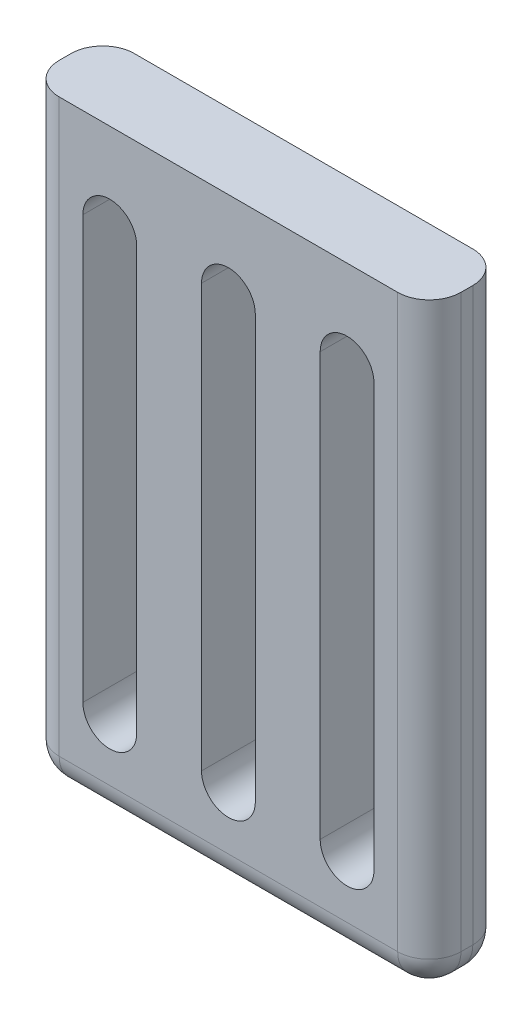
ISO-10303-21;
HEADER;
FILE_DESCRIPTION(('STEP AP214'),'2;1');
FILE_NAME('part.step','',(''),(''),'','','');
FILE_SCHEMA(('AUTOMOTIVE_DESIGN { 1 0 10303 214 1 1 1 1 }'));
ENDSEC;
DATA;
#1=APPLICATION_CONTEXT('core data for automotive mechanical design processes');
#2=APPLICATION_PROTOCOL_DEFINITION('international standard','automotive_design',2000,#1);
#3=PRODUCT_CONTEXT('',#1,'mechanical');
#4=PRODUCT('Part','Part','',(#3));
#5=PRODUCT_RELATED_PRODUCT_CATEGORY('part','',(#4));
#6=PRODUCT_DEFINITION_FORMATION('','',#4);
#7=PRODUCT_DEFINITION_CONTEXT('part definition',#1,'design');
#8=PRODUCT_DEFINITION('design','',#6,#7);
#9=PRODUCT_DEFINITION_SHAPE('','',#8);
#10=(LENGTH_UNIT() NAMED_UNIT(*) SI_UNIT(.MILLI.,.METRE.));
#11=(NAMED_UNIT(*) PLANE_ANGLE_UNIT() SI_UNIT($,.RADIAN.));
#12=(NAMED_UNIT(*) SI_UNIT($,.STERADIAN.) SOLID_ANGLE_UNIT());
#13=UNCERTAINTY_MEASURE_WITH_UNIT(LENGTH_MEASURE(1.E-05),#10,'distance_accuracy_value','');
#14=(GEOMETRIC_REPRESENTATION_CONTEXT(3) GLOBAL_UNCERTAINTY_ASSIGNED_CONTEXT((#13)) GLOBAL_UNIT_ASSIGNED_CONTEXT((#10,
#11,#12)) REPRESENTATION_CONTEXT('',''));
#15=CARTESIAN_POINT('',(0.,0.,0.));
#16=DIRECTION('',(0.,0.,1.));
#17=DIRECTION('',(1.,0.,0.));
#18=AXIS2_PLACEMENT_3D('',#15,#16,#17);
#19=CARTESIAN_POINT('',(0.,-13.35,0.));
#20=DIRECTION('',(0.,0.,1.));
#21=DIRECTION('',(1.,0.,0.));
#22=AXIS2_PLACEMENT_3D('',#19,#20,#21);
#23=CYLINDRICAL_SURFACE('',#22,1.7);
#24=DIRECTION('',(0.,0.,-1.));
#25=VECTOR('',#24,1.);
#26=CARTESIAN_POINT('',(1.7,-13.35,0.));
#27=LINE('',#26,#25);
#28=CARTESIAN_POINT('',(1.7,-13.35,0.));
#29=VERTEX_POINT('',#28);
#30=CARTESIAN_POINT('',(1.7,-13.35,4.75));
#31=VERTEX_POINT('',#30);
#32=EDGE_CURVE('E446',#29,#31,#27,.F.);
#33=ORIENTED_EDGE('',*,*,#32,.F.);
#34=CARTESIAN_POINT('',(0.,-13.35,0.));
#35=DIRECTION('',(0.,0.,1.));
#36=DIRECTION('',(1.,0.,0.));
#37=AXIS2_PLACEMENT_3D('',#34,#35,#36);
#38=CIRCLE('',#37,1.7);
#39=CARTESIAN_POINT('',(-1.7,-13.35,0.));
#40=VERTEX_POINT('',#39);
#41=EDGE_CURVE('E56',#29,#40,#38,.F.);
#42=ORIENTED_EDGE('',*,*,#41,.T.);
#43=DIRECTION('',(0.,0.,-1.));
#44=VECTOR('',#43,1.);
#45=CARTESIAN_POINT('',(-1.7,-13.35,0.));
#46=LINE('',#45,#44);
#47=CARTESIAN_POINT('',(-1.7,-13.35,4.75));
#48=VERTEX_POINT('',#47);
#49=EDGE_CURVE('E450',#48,#40,#46,.T.);
#50=ORIENTED_EDGE('',*,*,#49,.F.);
#51=CARTESIAN_POINT('',(0.,-13.35,4.75));
#52=DIRECTION('',(0.,0.,1.));
#53=DIRECTION('',(1.,0.,0.));
#54=AXIS2_PLACEMENT_3D('',#51,#52,#53);
#55=CIRCLE('',#54,1.7);
#56=EDGE_CURVE('E11',#48,#31,#55,.T.);
#57=ORIENTED_EDGE('',*,*,#56,.T.);
#58=EDGE_LOOP('',(#33,#42,#50,#57));
#59=FACE_BOUND('',#58,.T.);
#60=ADVANCED_FACE('F47',(#59),#23,.F.);
#61=CARTESIAN_POINT('',(0.,13.35,0.));
#62=DIRECTION('',(0.,0.,1.));
#63=DIRECTION('',(1.,0.,0.));
#64=AXIS2_PLACEMENT_3D('',#61,#62,#63);
#65=CYLINDRICAL_SURFACE('',#64,1.7);
#66=DIRECTION('',(0.,0.,-1.));
#67=VECTOR('',#66,1.);
#68=CARTESIAN_POINT('',(-1.7,13.35,0.));
#69=LINE('',#68,#67);
#70=CARTESIAN_POINT('',(-1.7,13.35,0.));
#71=VERTEX_POINT('',#70);
#72=CARTESIAN_POINT('',(-1.7,13.35,4.75));
#73=VERTEX_POINT('',#72);
#74=EDGE_CURVE('E385',#71,#73,#69,.F.);
#75=ORIENTED_EDGE('',*,*,#74,.F.);
#76=CARTESIAN_POINT('',(0.,13.35,0.));
#77=DIRECTION('',(0.,0.,1.));
#78=DIRECTION('',(1.,0.,0.));
#79=AXIS2_PLACEMENT_3D('',#76,#77,#78);
#80=CIRCLE('',#79,1.7);
#81=CARTESIAN_POINT('',(1.7,13.35,0.));
#82=VERTEX_POINT('',#81);
#83=EDGE_CURVE('E439',#71,#82,#80,.F.);
#84=ORIENTED_EDGE('',*,*,#83,.T.);
#85=DIRECTION('',(0.,0.,-1.));
#86=VECTOR('',#85,1.);
#87=CARTESIAN_POINT('',(1.7,13.35,0.));
#88=LINE('',#87,#86);
#89=CARTESIAN_POINT('',(1.7,13.35,4.75));
#90=VERTEX_POINT('',#89);
#91=EDGE_CURVE('E435',#90,#82,#88,.T.);
#92=ORIENTED_EDGE('',*,*,#91,.F.);
#93=CARTESIAN_POINT('',(0.,13.35,4.75));
#94=DIRECTION('',(0.,0.,1.));
#95=DIRECTION('',(1.,0.,0.));
#96=AXIS2_PLACEMENT_3D('',#93,#94,#95);
#97=CIRCLE('',#96,1.7);
#98=EDGE_CURVE('E443',#90,#73,#97,.T.);
#99=ORIENTED_EDGE('',*,*,#98,.T.);
#100=EDGE_LOOP('',(#75,#84,#92,#99));
#101=FACE_BOUND('',#100,.T.);
#102=ADVANCED_FACE('F477',(#101),#65,.F.);
#103=CARTESIAN_POINT('',(7.5,-13.35,4.75));
#104=DIRECTION('',(0.,0.,1.));
#105=DIRECTION('',(1.,0.,0.));
#106=AXIS2_PLACEMENT_3D('',#103,#104,#105);
#107=CYLINDRICAL_SURFACE('',#106,1.7);
#108=DIRECTION('',(0.,0.,-1.));
#109=VECTOR('',#108,1.);
#110=CARTESIAN_POINT('',(5.8,-13.35,4.75));
#111=LINE('',#110,#109);
#112=CARTESIAN_POINT('',(5.8,-13.35,4.75));
#113=VERTEX_POINT('',#112);
#114=CARTESIAN_POINT('',(5.8,-13.35,0.));
#115=VERTEX_POINT('',#114);
#116=EDGE_CURVE('E309',#113,#115,#111,.T.);
#117=ORIENTED_EDGE('',*,*,#116,.F.);
#118=CARTESIAN_POINT('',(7.5,-13.35,4.75));
#119=DIRECTION('',(0.,0.,1.));
#120=DIRECTION('',(1.,0.,0.));
#121=AXIS2_PLACEMENT_3D('',#118,#119,#120);
#122=CIRCLE('',#121,1.7);
#123=CARTESIAN_POINT('',(9.2,-13.35,4.75));
#124=VERTEX_POINT('',#123);
#125=EDGE_CURVE('E317',#113,#124,#122,.T.);
#126=ORIENTED_EDGE('',*,*,#125,.T.);
#127=DIRECTION('',(0.,0.,-1.));
#128=VECTOR('',#127,1.);
#129=CARTESIAN_POINT('',(9.2,-13.35,4.75));
#130=LINE('',#129,#128);
#131=CARTESIAN_POINT('',(9.2,-13.35,0.));
#132=VERTEX_POINT('',#131);
#133=EDGE_CURVE('E313',#132,#124,#130,.F.);
#134=ORIENTED_EDGE('',*,*,#133,.F.);
#135=CARTESIAN_POINT('',(7.5,-13.35,0.));
#136=DIRECTION('',(0.,0.,1.));
#137=DIRECTION('',(1.,0.,0.));
#138=AXIS2_PLACEMENT_3D('',#135,#136,#137);
#139=CIRCLE('',#138,1.7);
#140=EDGE_CURVE('E320',#132,#115,#139,.F.);
#141=ORIENTED_EDGE('',*,*,#140,.T.);
#142=EDGE_LOOP('',(#117,#126,#134,#141));
#143=FACE_BOUND('',#142,.T.);
#144=ADVANCED_FACE('F472',(#143),#107,.F.);
#145=CARTESIAN_POINT('',(7.5,13.35,0.));
#146=DIRECTION('',(0.,0.,1.));
#147=DIRECTION('',(1.,0.,0.));
#148=AXIS2_PLACEMENT_3D('',#145,#146,#147);
#149=CYLINDRICAL_SURFACE('',#148,1.7);
#150=DIRECTION('',(0.,0.,-1.));
#151=VECTOR('',#150,1.);
#152=CARTESIAN_POINT('',(5.8,13.35,0.));
#153=LINE('',#152,#151);
#154=CARTESIAN_POINT('',(5.8,13.35,0.));
#155=VERTEX_POINT('',#154);
#156=CARTESIAN_POINT('',(5.8,13.35,4.75));
#157=VERTEX_POINT('',#156);
#158=EDGE_CURVE('E294',#155,#157,#153,.F.);
#159=ORIENTED_EDGE('',*,*,#158,.F.);
#160=CARTESIAN_POINT('',(7.5,13.35,0.));
#161=DIRECTION('',(0.,0.,1.));
#162=DIRECTION('',(1.,0.,0.));
#163=AXIS2_PLACEMENT_3D('',#160,#161,#162);
#164=CIRCLE('',#163,1.7);
#165=CARTESIAN_POINT('',(9.2,13.35,0.));
#166=VERTEX_POINT('',#165);
#167=EDGE_CURVE('E302',#155,#166,#164,.F.);
#168=ORIENTED_EDGE('',*,*,#167,.T.);
#169=DIRECTION('',(0.,0.,-1.));
#170=VECTOR('',#169,1.);
#171=CARTESIAN_POINT('',(9.2,13.35,0.));
#172=LINE('',#171,#170);
#173=CARTESIAN_POINT('',(9.2,13.35,4.75));
#174=VERTEX_POINT('',#173);
#175=EDGE_CURVE('E298',#174,#166,#172,.T.);
#176=ORIENTED_EDGE('',*,*,#175,.F.);
#177=CARTESIAN_POINT('',(7.5,13.35,4.75));
#178=DIRECTION('',(0.,0.,1.));
#179=DIRECTION('',(1.,0.,0.));
#180=AXIS2_PLACEMENT_3D('',#177,#178,#179);
#181=CIRCLE('',#180,1.7);
#182=EDGE_CURVE('E306',#174,#157,#181,.T.);
#183=ORIENTED_EDGE('',*,*,#182,.T.);
#184=EDGE_LOOP('',(#159,#168,#176,#183));
#185=FACE_BOUND('',#184,.T.);
#186=ADVANCED_FACE('F463',(#185),#149,.F.);
#187=CARTESIAN_POINT('',(-7.5,-13.35,4.75));
#188=DIRECTION('',(0.,0.,1.));
#189=DIRECTION('',(1.,0.,0.));
#190=AXIS2_PLACEMENT_3D('',#187,#188,#189);
#191=CYLINDRICAL_SURFACE('',#190,1.7);
#192=DIRECTION('',(0.,0.,-1.));
#193=VECTOR('',#192,1.);
#194=CARTESIAN_POINT('',(-9.2,-13.35,4.75));
#195=LINE('',#194,#193);
#196=CARTESIAN_POINT('',(-9.2,-13.35,4.75));
#197=VERTEX_POINT('',#196);
#198=CARTESIAN_POINT('',(-9.2,-13.35,0.));
#199=VERTEX_POINT('',#198);
#200=EDGE_CURVE('E208',#197,#199,#195,.T.);
#201=ORIENTED_EDGE('',*,*,#200,.F.);
#202=CARTESIAN_POINT('',(-7.5,-13.35,4.75));
#203=DIRECTION('',(0.,0.,1.));
#204=DIRECTION('',(1.,0.,0.));
#205=AXIS2_PLACEMENT_3D('',#202,#203,#204);
#206=CIRCLE('',#205,1.7);
#207=CARTESIAN_POINT('',(-5.8,-13.35,4.75));
#208=VERTEX_POINT('',#207);
#209=EDGE_CURVE('E223',#197,#208,#206,.T.);
#210=ORIENTED_EDGE('',*,*,#209,.T.);
#211=DIRECTION('',(0.,0.,-1.));
#212=VECTOR('',#211,1.);
#213=CARTESIAN_POINT('',(-5.8,-13.35,4.75));
#214=LINE('',#213,#212);
#215=CARTESIAN_POINT('',(-5.8,-13.35,0.));
#216=VERTEX_POINT('',#215);
#217=EDGE_CURVE('E285',#216,#208,#214,.F.);
#218=ORIENTED_EDGE('',*,*,#217,.F.);
#219=CARTESIAN_POINT('',(-7.5,-13.35,0.));
#220=DIRECTION('',(0.,0.,1.));
#221=DIRECTION('',(1.,0.,0.));
#222=AXIS2_PLACEMENT_3D('',#219,#220,#221);
#223=CIRCLE('',#222,1.7);
#224=EDGE_CURVE('E291',#216,#199,#223,.F.);
#225=ORIENTED_EDGE('',*,*,#224,.T.);
#226=EDGE_LOOP('',(#201,#210,#218,#225));
#227=FACE_BOUND('',#226,.T.);
#228=ADVANCED_FACE('F461',(#227),#191,.F.);
#229=CARTESIAN_POINT('',(-7.5,13.35,0.));
#230=DIRECTION('',(0.,0.,1.));
#231=DIRECTION('',(1.,0.,0.));
#232=AXIS2_PLACEMENT_3D('',#229,#230,#231);
#233=CYLINDRICAL_SURFACE('',#232,1.7);
#234=DIRECTION('',(0.,0.,-1.));
#235=VECTOR('',#234,1.);
#236=CARTESIAN_POINT('',(-9.2,13.35,0.));
#237=LINE('',#236,#235);
#238=CARTESIAN_POINT('',(-9.2,13.35,0.));
#239=VERTEX_POINT('',#238);
#240=CARTESIAN_POINT('',(-9.2,13.35,4.75));
#241=VERTEX_POINT('',#240);
#242=EDGE_CURVE('E200',#239,#241,#237,.F.);
#243=ORIENTED_EDGE('',*,*,#242,.F.);
#244=CARTESIAN_POINT('',(-7.5,13.35,0.));
#245=DIRECTION('',(0.,0.,1.));
#246=DIRECTION('',(1.,0.,0.));
#247=AXIS2_PLACEMENT_3D('',#244,#245,#246);
#248=CIRCLE('',#247,1.7);
#249=CARTESIAN_POINT('',(-5.8,13.35,0.));
#250=VERTEX_POINT('',#249);
#251=EDGE_CURVE('E209',#239,#250,#248,.F.);
#252=ORIENTED_EDGE('',*,*,#251,.T.);
#253=DIRECTION('',(0.,0.,-1.));
#254=VECTOR('',#253,1.);
#255=CARTESIAN_POINT('',(-5.8,13.35,0.));
#256=LINE('',#255,#254);
#257=CARTESIAN_POINT('',(-5.8,13.35,4.75));
#258=VERTEX_POINT('',#257);
#259=EDGE_CURVE('E203',#258,#250,#256,.T.);
#260=ORIENTED_EDGE('',*,*,#259,.F.);
#261=CARTESIAN_POINT('',(-7.5,13.35,4.75));
#262=DIRECTION('',(0.,0.,1.));
#263=DIRECTION('',(1.,0.,0.));
#264=AXIS2_PLACEMENT_3D('',#261,#262,#263);
#265=CIRCLE('',#264,1.7);
#266=EDGE_CURVE('E196',#258,#241,#265,.T.);
#267=ORIENTED_EDGE('',*,*,#266,.T.);
#268=EDGE_LOOP('',(#243,#252,#260,#267));
#269=FACE_BOUND('',#268,.T.);
#270=ADVANCED_FACE('F198',(#269),#233,.F.);
#271=CARTESIAN_POINT('',(12.7,19.05,4.75));
#272=DIRECTION('',(-1.,0.,0.));
#273=DIRECTION('',(0.,-1.,0.));
#274=AXIS2_PLACEMENT_3D('',#271,#272,#273);
#275=PLANE('',#274);
#276=DIRECTION('',(0.,0.,-1.));
#277=VECTOR('',#276,1.);
#278=CARTESIAN_POINT('',(12.7,-17.05,4.75));
#279=LINE('',#278,#277);
#280=CARTESIAN_POINT('',(12.7,-17.05,2.75));
#281=VERTEX_POINT('',#280);
#282=CARTESIAN_POINT('',(12.7,-17.05,2.));
#283=VERTEX_POINT('',#282);
#284=EDGE_CURVE('E323',#281,#283,#279,.T.);
#285=ORIENTED_EDGE('',*,*,#284,.T.);
#286=DIRECTION('',(0.,1.,0.));
#287=VECTOR('',#286,1.);
#288=CARTESIAN_POINT('',(12.7,19.05,2.));
#289=LINE('',#288,#287);
#290=CARTESIAN_POINT('',(12.7,19.05,2.));
#291=VERTEX_POINT('',#290);
#292=EDGE_CURVE('E329',#283,#291,#289,.T.);
#293=ORIENTED_EDGE('',*,*,#292,.T.);
#294=DIRECTION('',(0.,0.,-1.));
#295=VECTOR('',#294,1.);
#296=CARTESIAN_POINT('',(12.7,19.05,4.75));
#297=LINE('',#296,#295);
#298=CARTESIAN_POINT('',(12.7,19.05,2.75));
#299=VERTEX_POINT('',#298);
#300=EDGE_CURVE('E219',#299,#291,#297,.T.);
#301=ORIENTED_EDGE('',*,*,#300,.F.);
#302=DIRECTION('',(0.,1.,0.));
#303=VECTOR('',#302,1.);
#304=CARTESIAN_POINT('',(12.7,-19.05,2.75));
#305=LINE('',#304,#303);
#306=EDGE_CURVE('E326',#299,#281,#305,.F.);
#307=ORIENTED_EDGE('',*,*,#306,.T.);
#308=EDGE_LOOP('',(#285,#293,#301,#307));
#309=FACE_BOUND('',#308,.T.);
#310=ADVANCED_FACE('F469',(#309),#275,.F.);
#311=CARTESIAN_POINT('',(-12.7,19.05,4.75));
#312=DIRECTION('',(0.,-1.,0.));
#313=DIRECTION('',(0.,0.,-1.));
#314=AXIS2_PLACEMENT_3D('',#311,#312,#313);
#315=PLANE('',#314);
#316=ORIENTED_EDGE('',*,*,#300,.T.);
#317=CARTESIAN_POINT('',(10.7,19.05,2.));
#318=DIRECTION('',(0.,-1.,0.));
#319=DIRECTION('',(0.,0.,-1.));
#320=AXIS2_PLACEMENT_3D('',#317,#318,#319);
#321=CIRCLE('',#320,2.);
#322=CARTESIAN_POINT('',(10.7,19.05,0.));
#323=VERTEX_POINT('',#322);
#324=EDGE_CURVE('E342',#291,#323,#321,.F.);
#325=ORIENTED_EDGE('',*,*,#324,.T.);
#326=DIRECTION('',(-1.,0.,0.));
#327=VECTOR('',#326,1.);
#328=CARTESIAN_POINT('',(-12.7,19.05,0.));
#329=LINE('',#328,#327);
#330=CARTESIAN_POINT('',(-10.7,19.05,0.));
#331=VERTEX_POINT('',#330);
#332=EDGE_CURVE('E269',#323,#331,#329,.T.);
#333=ORIENTED_EDGE('',*,*,#332,.T.);
#334=CARTESIAN_POINT('',(-10.7,19.05,2.));
#335=DIRECTION('',(0.,-1.,0.));
#336=DIRECTION('',(0.,0.,-1.));
#337=AXIS2_PLACEMENT_3D('',#334,#335,#336);
#338=CIRCLE('',#337,2.);
#339=CARTESIAN_POINT('',(-12.7,19.05,2.));
#340=VERTEX_POINT('',#339);
#341=EDGE_CURVE('E336',#331,#340,#338,.F.);
#342=ORIENTED_EDGE('',*,*,#341,.T.);
#343=DIRECTION('',(0.,0.,-1.));
#344=VECTOR('',#343,1.);
#345=CARTESIAN_POINT('',(-12.7,19.05,4.75));
#346=LINE('',#345,#344);
#347=CARTESIAN_POINT('',(-12.7,19.05,2.75));
#348=VERTEX_POINT('',#347);
#349=EDGE_CURVE('E268',#348,#340,#346,.T.);
#350=ORIENTED_EDGE('',*,*,#349,.F.);
#351=CARTESIAN_POINT('',(-10.7,19.05,2.75));
#352=DIRECTION('',(0.,-1.,0.));
#353=DIRECTION('',(0.,0.,-1.));
#354=AXIS2_PLACEMENT_3D('',#351,#352,#353);
#355=CIRCLE('',#354,2.);
#356=CARTESIAN_POINT('',(-10.7,19.05,4.75));
#357=VERTEX_POINT('',#356);
#358=EDGE_CURVE('E333',#348,#357,#355,.F.);
#359=ORIENTED_EDGE('',*,*,#358,.T.);
#360=DIRECTION('',(-1.,0.,0.));
#361=VECTOR('',#360,1.);
#362=CARTESIAN_POINT('',(-12.7,19.05,4.75));
#363=LINE('',#362,#361);
#364=CARTESIAN_POINT('',(10.7,19.05,4.75));
#365=VERTEX_POINT('',#364);
#366=EDGE_CURVE('E264',#365,#357,#363,.T.);
#367=ORIENTED_EDGE('',*,*,#366,.F.);
#368=CARTESIAN_POINT('',(10.7,19.05,2.75));
#369=DIRECTION('',(0.,-1.,0.));
#370=DIRECTION('',(0.,0.,-1.));
#371=AXIS2_PLACEMENT_3D('',#368,#369,#370);
#372=CIRCLE('',#371,2.);
#373=EDGE_CURVE('E339',#365,#299,#372,.F.);
#374=ORIENTED_EDGE('',*,*,#373,.T.);
#375=EDGE_LOOP('',(#316,#325,#333,#342,#350,#359,#367,#374));
#376=FACE_BOUND('',#375,.T.);
#377=ADVANCED_FACE('F524',(#376),#315,.F.);
#378=CARTESIAN_POINT('',(-12.7,19.05,4.75));
#379=DIRECTION('',(1.,0.,0.));
#380=DIRECTION('',(0.,1.,0.));
#381=AXIS2_PLACEMENT_3D('',#378,#379,#380);
#382=PLANE('',#381);
#383=ORIENTED_EDGE('',*,*,#349,.T.);
#384=DIRECTION('',(0.,-1.,0.));
#385=VECTOR('',#384,1.);
#386=CARTESIAN_POINT('',(-12.7,19.05,2.));
#387=LINE('',#386,#385);
#388=CARTESIAN_POINT('',(-12.7,-17.05,2.));
#389=VERTEX_POINT('',#388);
#390=EDGE_CURVE('E369',#340,#389,#387,.T.);
#391=ORIENTED_EDGE('',*,*,#390,.T.);
#392=DIRECTION('',(0.,0.,-1.));
#393=VECTOR('',#392,1.);
#394=CARTESIAN_POINT('',(-12.7,-17.05,4.75));
#395=LINE('',#394,#393);
#396=CARTESIAN_POINT('',(-12.7,-17.05,2.75));
#397=VERTEX_POINT('',#396);
#398=EDGE_CURVE('E363',#389,#397,#395,.F.);
#399=ORIENTED_EDGE('',*,*,#398,.T.);
#400=DIRECTION('',(0.,-1.,0.));
#401=VECTOR('',#400,1.);
#402=CARTESIAN_POINT('',(-12.7,19.05,2.75));
#403=LINE('',#402,#401);
#404=EDGE_CURVE('E366',#397,#348,#403,.F.);
#405=ORIENTED_EDGE('',*,*,#404,.T.);
#406=EDGE_LOOP('',(#383,#391,#399,#405));
#407=FACE_BOUND('',#406,.T.);
#408=ADVANCED_FACE('F560',(#407),#382,.F.);
#409=CARTESIAN_POINT('',(-12.7,-19.05,4.75));
#410=DIRECTION('',(0.,1.,0.));
#411=DIRECTION('',(0.,0.,1.));
#412=AXIS2_PLACEMENT_3D('',#409,#410,#411);
#413=PLANE('',#412);
#414=DIRECTION('',(1.,0.,0.));
#415=VECTOR('',#414,1.);
#416=CARTESIAN_POINT('',(-12.7,-19.05,2.));
#417=LINE('',#416,#415);
#418=CARTESIAN_POINT('',(-10.7,-19.05,2.));
#419=VERTEX_POINT('',#418);
#420=CARTESIAN_POINT('',(10.7,-19.05,2.));
#421=VERTEX_POINT('',#420);
#422=EDGE_CURVE('E378',#419,#421,#417,.T.);
#423=ORIENTED_EDGE('',*,*,#422,.T.);
#424=DIRECTION('',(0.,0.,-1.));
#425=VECTOR('',#424,1.);
#426=CARTESIAN_POINT('',(10.7,-19.05,4.75));
#427=LINE('',#426,#425);
#428=CARTESIAN_POINT('',(10.7,-19.05,2.75));
#429=VERTEX_POINT('',#428);
#430=EDGE_CURVE('E382',#421,#429,#427,.F.);
#431=ORIENTED_EDGE('',*,*,#430,.T.);
#432=DIRECTION('',(1.,0.,0.));
#433=VECTOR('',#432,1.);
#434=CARTESIAN_POINT('',(-12.7,-19.05,2.75));
#435=LINE('',#434,#433);
#436=CARTESIAN_POINT('',(-10.7,-19.05,2.75));
#437=VERTEX_POINT('',#436);
#438=EDGE_CURVE('E375',#429,#437,#435,.F.);
#439=ORIENTED_EDGE('',*,*,#438,.T.);
#440=DIRECTION('',(0.,0.,-1.));
#441=VECTOR('',#440,1.);
#442=CARTESIAN_POINT('',(-10.7,-19.05,4.75));
#443=LINE('',#442,#441);
#444=EDGE_CURVE('E372',#437,#419,#443,.T.);
#445=ORIENTED_EDGE('',*,*,#444,.T.);
#446=EDGE_LOOP('',(#423,#431,#439,#445));
#447=FACE_BOUND('',#446,.T.);
#448=ADVANCED_FACE('F495',(#447),#413,.F.);
#449=CARTESIAN_POINT('',(0.,0.,4.75));
#450=DIRECTION('',(0.,0.,1.));
#451=DIRECTION('',(1.,0.,0.));
#452=AXIS2_PLACEMENT_3D('',#449,#450,#451);
#453=PLANE('',#452);
#454=DIRECTION('',(0.,1.,0.));
#455=VECTOR('',#454,1.);
#456=CARTESIAN_POINT('',(-5.8,-15.05,4.75));
#457=LINE('',#456,#455);
#458=EDGE_CURVE('E227',#208,#258,#457,.T.);
#459=ORIENTED_EDGE('',*,*,#458,.F.);
#460=ORIENTED_EDGE('',*,*,#209,.F.);
#461=DIRECTION('',(0.,-1.,0.));
#462=VECTOR('',#461,1.);
#463=CARTESIAN_POINT('',(-9.2,-15.05,4.75));
#464=LINE('',#463,#462);
#465=EDGE_CURVE('E215',#241,#197,#464,.T.);
#466=ORIENTED_EDGE('',*,*,#465,.F.);
#467=ORIENTED_EDGE('',*,*,#266,.F.);
#468=EDGE_LOOP('',(#459,#460,#466,#467));
#469=FACE_BOUND('',#468,.T.);
#470=DIRECTION('',(0.,1.,0.));
#471=VECTOR('',#470,1.);
#472=CARTESIAN_POINT('',(9.2,-15.05,4.75));
#473=LINE('',#472,#471);
#474=EDGE_CURVE('E232',#124,#174,#473,.T.);
#475=ORIENTED_EDGE('',*,*,#474,.F.);
#476=ORIENTED_EDGE('',*,*,#125,.F.);
#477=DIRECTION('',(0.,-1.,0.));
#478=VECTOR('',#477,1.);
#479=CARTESIAN_POINT('',(5.8,-15.05,4.75));
#480=LINE('',#479,#478);
#481=EDGE_CURVE('E236',#157,#113,#480,.T.);
#482=ORIENTED_EDGE('',*,*,#481,.F.);
#483=ORIENTED_EDGE('',*,*,#182,.F.);
#484=EDGE_LOOP('',(#475,#476,#482,#483));
#485=FACE_BOUND('',#484,.T.);
#486=DIRECTION('',(0.,1.,0.));
#487=VECTOR('',#486,1.);
#488=CARTESIAN_POINT('',(1.7,15.05,4.75));
#489=LINE('',#488,#487);
#490=EDGE_CURVE('E247',#31,#90,#489,.T.);
#491=ORIENTED_EDGE('',*,*,#490,.F.);
#492=ORIENTED_EDGE('',*,*,#56,.F.);
#493=DIRECTION('',(0.,-1.,0.));
#494=VECTOR('',#493,1.);
#495=CARTESIAN_POINT('',(-1.7,15.05,4.75));
#496=LINE('',#495,#494);
#497=EDGE_CURVE('E250',#73,#48,#496,.T.);
#498=ORIENTED_EDGE('',*,*,#497,.F.);
#499=ORIENTED_EDGE('',*,*,#98,.F.);
#500=EDGE_LOOP('',(#491,#492,#498,#499));
#501=FACE_BOUND('',#500,.T.);
#502=DIRECTION('',(1.,0.,0.));
#503=VECTOR('',#502,1.);
#504=CARTESIAN_POINT('',(12.7,-17.05,4.75));
#505=LINE('',#504,#503);
#506=CARTESIAN_POINT('',(-10.7,-17.05,4.75));
#507=VERTEX_POINT('',#506);
#508=CARTESIAN_POINT('',(10.7,-17.05,4.75));
#509=VERTEX_POINT('',#508);
#510=EDGE_CURVE('E354',#507,#509,#505,.T.);
#511=ORIENTED_EDGE('',*,*,#510,.T.);
#512=DIRECTION('',(0.,1.,0.));
#513=VECTOR('',#512,1.);
#514=CARTESIAN_POINT('',(10.7,19.05,4.75));
#515=LINE('',#514,#513);
#516=EDGE_CURVE('E360',#509,#365,#515,.T.);
#517=ORIENTED_EDGE('',*,*,#516,.T.);
#518=ORIENTED_EDGE('',*,*,#366,.T.);
#519=DIRECTION('',(0.,-1.,0.));
#520=VECTOR('',#519,1.);
#521=CARTESIAN_POINT('',(-10.7,-19.05,4.75));
#522=LINE('',#521,#520);
#523=EDGE_CURVE('E357',#357,#507,#522,.T.);
#524=ORIENTED_EDGE('',*,*,#523,.T.);
#525=EDGE_LOOP('',(#511,#517,#518,#524));
#526=FACE_BOUND('',#525,.T.);
#527=ADVANCED_FACE('F221',(#469,#485,#501,#526),#453,.T.);
#528=CARTESIAN_POINT('',(0.,0.,0.));
#529=DIRECTION('',(0.,0.,1.));
#530=DIRECTION('',(1.,0.,0.));
#531=AXIS2_PLACEMENT_3D('',#528,#529,#530);
#532=PLANE('',#531);
#533=ORIENTED_EDGE('',*,*,#41,.F.);
#534=DIRECTION('',(0.,1.,0.));
#535=VECTOR('',#534,1.);
#536=CARTESIAN_POINT('',(1.7,15.05,0.));
#537=LINE('',#536,#535);
#538=EDGE_CURVE('E254',#29,#82,#537,.T.);
#539=ORIENTED_EDGE('',*,*,#538,.T.);
#540=ORIENTED_EDGE('',*,*,#83,.F.);
#541=DIRECTION('',(0.,-1.,0.));
#542=VECTOR('',#541,1.);
#543=CARTESIAN_POINT('',(-1.7,15.05,0.));
#544=LINE('',#543,#542);
#545=EDGE_CURVE('E257',#71,#40,#544,.T.);
#546=ORIENTED_EDGE('',*,*,#545,.T.);
#547=EDGE_LOOP('',(#533,#539,#540,#546));
#548=FACE_BOUND('',#547,.T.);
#549=ORIENTED_EDGE('',*,*,#332,.F.);
#550=DIRECTION('',(0.,1.,0.));
#551=VECTOR('',#550,1.);
#552=CARTESIAN_POINT('',(10.7,0.,0.));
#553=LINE('',#552,#551);
#554=CARTESIAN_POINT('',(10.7,-17.05,0.));
#555=VERTEX_POINT('',#554);
#556=EDGE_CURVE('E351',#323,#555,#553,.F.);
#557=ORIENTED_EDGE('',*,*,#556,.T.);
#558=DIRECTION('',(1.,0.,0.));
#559=VECTOR('',#558,1.);
#560=CARTESIAN_POINT('',(0.,-17.05,0.));
#561=LINE('',#560,#559);
#562=CARTESIAN_POINT('',(-10.7,-17.05,0.));
#563=VERTEX_POINT('',#562);
#564=EDGE_CURVE('E345',#555,#563,#561,.F.);
#565=ORIENTED_EDGE('',*,*,#564,.T.);
#566=DIRECTION('',(0.,-1.,0.));
#567=VECTOR('',#566,1.);
#568=CARTESIAN_POINT('',(-10.7,0.,0.));
#569=LINE('',#568,#567);
#570=EDGE_CURVE('E348',#563,#331,#569,.F.);
#571=ORIENTED_EDGE('',*,*,#570,.T.);
#572=EDGE_LOOP('',(#549,#557,#565,#571));
#573=FACE_BOUND('',#572,.T.);
#574=ORIENTED_EDGE('',*,*,#140,.F.);
#575=DIRECTION('',(0.,1.,0.));
#576=VECTOR('',#575,1.);
#577=CARTESIAN_POINT('',(9.2,-15.05,0.));
#578=LINE('',#577,#576);
#579=EDGE_CURVE('E240',#132,#166,#578,.T.);
#580=ORIENTED_EDGE('',*,*,#579,.T.);
#581=ORIENTED_EDGE('',*,*,#167,.F.);
#582=DIRECTION('',(0.,-1.,0.));
#583=VECTOR('',#582,1.);
#584=CARTESIAN_POINT('',(5.8,-15.05,0.));
#585=LINE('',#584,#583);
#586=EDGE_CURVE('E243',#155,#115,#585,.T.);
#587=ORIENTED_EDGE('',*,*,#586,.T.);
#588=EDGE_LOOP('',(#574,#580,#581,#587));
#589=FACE_BOUND('',#588,.T.);
#590=ORIENTED_EDGE('',*,*,#224,.F.);
#591=DIRECTION('',(0.,1.,0.));
#592=VECTOR('',#591,1.);
#593=CARTESIAN_POINT('',(-5.8,-15.05,0.));
#594=LINE('',#593,#592);
#595=EDGE_CURVE('E226',#216,#250,#594,.T.);
#596=ORIENTED_EDGE('',*,*,#595,.T.);
#597=ORIENTED_EDGE('',*,*,#251,.F.);
#598=DIRECTION('',(0.,-1.,0.));
#599=VECTOR('',#598,1.);
#600=CARTESIAN_POINT('',(-9.2,-15.05,0.));
#601=LINE('',#600,#599);
#602=EDGE_CURVE('E217',#239,#199,#601,.T.);
#603=ORIENTED_EDGE('',*,*,#602,.T.);
#604=EDGE_LOOP('',(#590,#596,#597,#603));
#605=FACE_BOUND('',#604,.T.);
#606=ADVANCED_FACE('F455',(#548,#573,#589,#605),#532,.F.);
#607=CARTESIAN_POINT('',(1.7,15.05,0.));
#608=DIRECTION('',(1.,0.,0.));
#609=DIRECTION('',(0.,1.,0.));
#610=AXIS2_PLACEMENT_3D('',#607,#608,#609);
#611=PLANE('',#610);
#612=ORIENTED_EDGE('',*,*,#538,.F.);
#613=ORIENTED_EDGE('',*,*,#32,.T.);
#614=ORIENTED_EDGE('',*,*,#490,.T.);
#615=ORIENTED_EDGE('',*,*,#91,.T.);
#616=EDGE_LOOP('',(#612,#613,#614,#615));
#617=FACE_BOUND('',#616,.T.);
#618=ADVANCED_FACE('F485',(#617),#611,.F.);
#619=CARTESIAN_POINT('',(-1.7,15.05,0.));
#620=DIRECTION('',(-1.,0.,0.));
#621=DIRECTION('',(0.,-1.,0.));
#622=AXIS2_PLACEMENT_3D('',#619,#620,#621);
#623=PLANE('',#622);
#624=ORIENTED_EDGE('',*,*,#497,.T.);
#625=ORIENTED_EDGE('',*,*,#49,.T.);
#626=ORIENTED_EDGE('',*,*,#545,.F.);
#627=ORIENTED_EDGE('',*,*,#74,.T.);
#628=EDGE_LOOP('',(#624,#625,#626,#627));
#629=FACE_BOUND('',#628,.T.);
#630=ADVANCED_FACE('F493',(#629),#623,.F.);
#631=CARTESIAN_POINT('',(9.2,-15.05,0.));
#632=DIRECTION('',(1.,0.,0.));
#633=DIRECTION('',(0.,0.,-1.));
#634=AXIS2_PLACEMENT_3D('',#631,#632,#633);
#635=PLANE('',#634);
#636=ORIENTED_EDGE('',*,*,#579,.F.);
#637=ORIENTED_EDGE('',*,*,#133,.T.);
#638=ORIENTED_EDGE('',*,*,#474,.T.);
#639=ORIENTED_EDGE('',*,*,#175,.T.);
#640=EDGE_LOOP('',(#636,#637,#638,#639));
#641=FACE_BOUND('',#640,.T.);
#642=ADVANCED_FACE('F719',(#641),#635,.F.);
#643=CARTESIAN_POINT('',(5.8,-15.05,0.));
#644=DIRECTION('',(-1.,0.,0.));
#645=DIRECTION('',(0.,0.,1.));
#646=AXIS2_PLACEMENT_3D('',#643,#644,#645);
#647=PLANE('',#646);
#648=ORIENTED_EDGE('',*,*,#481,.T.);
#649=ORIENTED_EDGE('',*,*,#116,.T.);
#650=ORIENTED_EDGE('',*,*,#586,.F.);
#651=ORIENTED_EDGE('',*,*,#158,.T.);
#652=EDGE_LOOP('',(#648,#649,#650,#651));
#653=FACE_BOUND('',#652,.T.);
#654=ADVANCED_FACE('F728',(#653),#647,.F.);
#655=CARTESIAN_POINT('',(-5.8,-15.05,0.));
#656=DIRECTION('',(1.,0.,0.));
#657=DIRECTION('',(0.,0.,-1.));
#658=AXIS2_PLACEMENT_3D('',#655,#656,#657);
#659=PLANE('',#658);
#660=ORIENTED_EDGE('',*,*,#595,.F.);
#661=ORIENTED_EDGE('',*,*,#217,.T.);
#662=ORIENTED_EDGE('',*,*,#458,.T.);
#663=ORIENTED_EDGE('',*,*,#259,.T.);
#664=EDGE_LOOP('',(#660,#661,#662,#663));
#665=FACE_BOUND('',#664,.T.);
#666=ADVANCED_FACE('F459',(#665),#659,.F.);
#667=CARTESIAN_POINT('',(-9.2,-15.05,0.));
#668=DIRECTION('',(-1.,0.,0.));
#669=DIRECTION('',(0.,0.,1.));
#670=AXIS2_PLACEMENT_3D('',#667,#668,#669);
#671=PLANE('',#670);
#672=ORIENTED_EDGE('',*,*,#465,.T.);
#673=ORIENTED_EDGE('',*,*,#200,.T.);
#674=ORIENTED_EDGE('',*,*,#602,.F.);
#675=ORIENTED_EDGE('',*,*,#242,.T.);
#676=EDGE_LOOP('',(#672,#673,#674,#675));
#677=FACE_BOUND('',#676,.T.);
#678=ADVANCED_FACE('F213',(#677),#671,.F.);
#679=CARTESIAN_POINT('',(-10.7,0.,2.75));
#680=DIRECTION('',(0.,1.,0.));
#681=DIRECTION('',(-1.,0.,0.));
#682=AXIS2_PLACEMENT_3D('',#679,#680,#681);
#683=CYLINDRICAL_SURFACE('',#682,2.);
#684=CARTESIAN_POINT('',(-10.7,-17.05,2.75));
#685=DIRECTION('',(0.,-1.,0.));
#686=DIRECTION('',(0.,0.,-1.));
#687=AXIS2_PLACEMENT_3D('',#684,#685,#686);
#688=CIRCLE('',#687,2.);
#689=EDGE_CURVE('E261',#507,#397,#688,.T.);
#690=ORIENTED_EDGE('',*,*,#689,.F.);
#691=ORIENTED_EDGE('',*,*,#523,.F.);
#692=ORIENTED_EDGE('',*,*,#358,.F.);
#693=ORIENTED_EDGE('',*,*,#404,.F.);
#694=EDGE_LOOP('',(#690,#691,#692,#693));
#695=FACE_BOUND('',#694,.T.);
#696=ADVANCED_FACE('F529',(#695),#683,.T.);
#697=CARTESIAN_POINT('',(-10.7,-17.05,2.75));
#698=DIRECTION('',(-1.,0.,0.));
#699=DIRECTION('',(0.,0.,1.));
#700=AXIS2_PLACEMENT_3D('',#697,#698,#699);
#701=SPHERICAL_SURFACE('',#700,2.);
#702=CARTESIAN_POINT('',(-10.7,-17.05,2.75));
#703=DIRECTION('',(-1.,0.,0.));
#704=DIRECTION('',(0.,0.,1.));
#705=AXIS2_PLACEMENT_3D('',#702,#703,#704);
#706=CIRCLE('',#705,2.);
#707=EDGE_CURVE('E421',#507,#437,#706,.F.);
#708=ORIENTED_EDGE('',*,*,#707,.F.);
#709=ORIENTED_EDGE('',*,*,#689,.T.);
#710=CARTESIAN_POINT('',(-10.7,-17.05,2.75));
#711=DIRECTION('',(0.,0.,1.));
#712=DIRECTION('',(1.,0.,0.));
#713=AXIS2_PLACEMENT_3D('',#710,#711,#712);
#714=CIRCLE('',#713,2.);
#715=EDGE_CURVE('E425',#437,#397,#714,.F.);
#716=ORIENTED_EDGE('',*,*,#715,.F.);
#717=EDGE_LOOP('',(#708,#709,#716));
#718=FACE_BOUND('',#717,.T.);
#719=ADVANCED_FACE('F534',(#718),#701,.T.);
#720=CARTESIAN_POINT('',(-10.7,19.05,2.));
#721=DIRECTION('',(0.,-1.,0.));
#722=DIRECTION('',(1.,0.,0.));
#723=AXIS2_PLACEMENT_3D('',#720,#721,#722);
#724=CYLINDRICAL_SURFACE('',#723,2.);
#725=ORIENTED_EDGE('',*,*,#341,.F.);
#726=ORIENTED_EDGE('',*,*,#570,.F.);
#727=CARTESIAN_POINT('',(-10.7,-17.05,2.));
#728=DIRECTION('',(0.,-1.,0.));
#729=DIRECTION('',(0.,0.,-1.));
#730=AXIS2_PLACEMENT_3D('',#727,#728,#729);
#731=CIRCLE('',#730,2.);
#732=EDGE_CURVE('E417',#389,#563,#731,.T.);
#733=ORIENTED_EDGE('',*,*,#732,.F.);
#734=ORIENTED_EDGE('',*,*,#390,.F.);
#735=EDGE_LOOP('',(#725,#726,#733,#734));
#736=FACE_BOUND('',#735,.T.);
#737=ADVANCED_FACE('F557',(#736),#724,.T.);
#738=CARTESIAN_POINT('',(-10.7,-17.05,4.75));
#739=DIRECTION('',(0.,0.,-1.));
#740=DIRECTION('',(-1.,0.,0.));
#741=AXIS2_PLACEMENT_3D('',#738,#739,#740);
#742=CYLINDRICAL_SURFACE('',#741,2.);
#743=ORIENTED_EDGE('',*,*,#715,.T.);
#744=ORIENTED_EDGE('',*,*,#398,.F.);
#745=CARTESIAN_POINT('',(-10.7,-17.05,2.));
#746=DIRECTION('',(0.,0.,-1.));
#747=DIRECTION('',(-1.,0.,0.));
#748=AXIS2_PLACEMENT_3D('',#745,#746,#747);
#749=CIRCLE('',#748,2.);
#750=EDGE_CURVE('E413',#419,#389,#749,.T.);
#751=ORIENTED_EDGE('',*,*,#750,.F.);
#752=ORIENTED_EDGE('',*,*,#444,.F.);
#753=EDGE_LOOP('',(#743,#744,#751,#752));
#754=FACE_BOUND('',#753,.T.);
#755=ADVANCED_FACE('F539',(#754),#742,.T.);
#756=CARTESIAN_POINT('',(0.,-17.05,2.75));
#757=DIRECTION('',(-1.,0.,0.));
#758=DIRECTION('',(0.,0.,1.));
#759=AXIS2_PLACEMENT_3D('',#756,#757,#758);
#760=CYLINDRICAL_SURFACE('',#759,2.);
#761=ORIENTED_EDGE('',*,*,#707,.T.);
#762=ORIENTED_EDGE('',*,*,#438,.F.);
#763=CARTESIAN_POINT('',(10.7,-17.05,2.75));
#764=DIRECTION('',(1.,0.,0.));
#765=DIRECTION('',(0.,0.,-1.));
#766=AXIS2_PLACEMENT_3D('',#763,#764,#765);
#767=CIRCLE('',#766,2.);
#768=EDGE_CURVE('E409',#509,#429,#767,.T.);
#769=ORIENTED_EDGE('',*,*,#768,.F.);
#770=ORIENTED_EDGE('',*,*,#510,.F.);
#771=EDGE_LOOP('',(#761,#762,#769,#770));
#772=FACE_BOUND('',#771,.T.);
#773=ADVANCED_FACE('F511',(#772),#760,.T.);
#774=CARTESIAN_POINT('',(10.7,0.,2.75));
#775=DIRECTION('',(0.,-1.,0.));
#776=DIRECTION('',(1.,0.,0.));
#777=AXIS2_PLACEMENT_3D('',#774,#775,#776);
#778=CYLINDRICAL_SURFACE('',#777,2.);
#779=ORIENTED_EDGE('',*,*,#373,.F.);
#780=ORIENTED_EDGE('',*,*,#516,.F.);
#781=CARTESIAN_POINT('',(10.7,-17.05,2.75));
#782=DIRECTION('',(0.,-1.,0.));
#783=DIRECTION('',(0.,0.,-1.));
#784=AXIS2_PLACEMENT_3D('',#781,#782,#783);
#785=CIRCLE('',#784,2.);
#786=EDGE_CURVE('E405',#281,#509,#785,.T.);
#787=ORIENTED_EDGE('',*,*,#786,.F.);
#788=ORIENTED_EDGE('',*,*,#306,.F.);
#789=EDGE_LOOP('',(#779,#780,#787,#788));
#790=FACE_BOUND('',#789,.T.);
#791=ADVANCED_FACE('F507',(#790),#778,.T.);
#792=CARTESIAN_POINT('',(-10.7,-17.05,2.));
#793=DIRECTION('',(-1.,0.,0.));
#794=DIRECTION('',(0.,0.,1.));
#795=AXIS2_PLACEMENT_3D('',#792,#793,#794);
#796=SPHERICAL_SURFACE('',#795,2.);
#797=ORIENTED_EDGE('',*,*,#750,.T.);
#798=ORIENTED_EDGE('',*,*,#732,.T.);
#799=CARTESIAN_POINT('',(-10.7,-17.05,2.));
#800=DIRECTION('',(-1.,0.,0.));
#801=DIRECTION('',(0.,0.,1.));
#802=AXIS2_PLACEMENT_3D('',#799,#800,#801);
#803=CIRCLE('',#802,2.);
#804=EDGE_CURVE('E401',#419,#563,#803,.F.);
#805=ORIENTED_EDGE('',*,*,#804,.F.);
#806=EDGE_LOOP('',(#797,#798,#805));
#807=FACE_BOUND('',#806,.T.);
#808=ADVANCED_FACE('F603',(#807),#796,.T.);
#809=CARTESIAN_POINT('',(10.7,-17.05,2.75));
#810=DIRECTION('',(0.,0.,1.));
#811=DIRECTION('',(1.,0.,0.));
#812=AXIS2_PLACEMENT_3D('',#809,#810,#811);
#813=SPHERICAL_SURFACE('',#812,2.);
#814=ORIENTED_EDGE('',*,*,#786,.T.);
#815=ORIENTED_EDGE('',*,*,#768,.T.);
#816=CARTESIAN_POINT('',(10.7,-17.05,2.75));
#817=DIRECTION('',(0.,0.,1.));
#818=DIRECTION('',(1.,0.,0.));
#819=AXIS2_PLACEMENT_3D('',#816,#817,#818);
#820=CIRCLE('',#819,2.);
#821=EDGE_CURVE('E397',#281,#429,#820,.F.);
#822=ORIENTED_EDGE('',*,*,#821,.F.);
#823=EDGE_LOOP('',(#814,#815,#822));
#824=FACE_BOUND('',#823,.T.);
#825=ADVANCED_FACE('F513',(#824),#813,.T.);
#826=CARTESIAN_POINT('',(-12.7,-17.05,2.));
#827=DIRECTION('',(1.,0.,0.));
#828=DIRECTION('',(0.,0.,-1.));
#829=AXIS2_PLACEMENT_3D('',#826,#827,#828);
#830=CYLINDRICAL_SURFACE('',#829,2.);
#831=ORIENTED_EDGE('',*,*,#804,.T.);
#832=ORIENTED_EDGE('',*,*,#564,.F.);
#833=CARTESIAN_POINT('',(10.7,-17.05,2.));
#834=DIRECTION('',(1.,0.,0.));
#835=DIRECTION('',(0.,0.,-1.));
#836=AXIS2_PLACEMENT_3D('',#833,#834,#835);
#837=CIRCLE('',#836,2.);
#838=EDGE_CURVE('E393',#421,#555,#837,.T.);
#839=ORIENTED_EDGE('',*,*,#838,.F.);
#840=ORIENTED_EDGE('',*,*,#422,.F.);
#841=EDGE_LOOP('',(#831,#832,#839,#840));
#842=FACE_BOUND('',#841,.T.);
#843=ADVANCED_FACE('F545',(#842),#830,.T.);
#844=CARTESIAN_POINT('',(10.7,-17.05,4.75));
#845=DIRECTION('',(0.,0.,-1.));
#846=DIRECTION('',(-1.,0.,0.));
#847=AXIS2_PLACEMENT_3D('',#844,#845,#846);
#848=CYLINDRICAL_SURFACE('',#847,2.);
#849=ORIENTED_EDGE('',*,*,#821,.T.);
#850=ORIENTED_EDGE('',*,*,#430,.F.);
#851=CARTESIAN_POINT('',(10.7,-17.05,2.));
#852=DIRECTION('',(0.,0.,-1.));
#853=DIRECTION('',(-1.,0.,0.));
#854=AXIS2_PLACEMENT_3D('',#851,#852,#853);
#855=CIRCLE('',#854,2.);
#856=EDGE_CURVE('E390',#283,#421,#855,.T.);
#857=ORIENTED_EDGE('',*,*,#856,.F.);
#858=ORIENTED_EDGE('',*,*,#284,.F.);
#859=EDGE_LOOP('',(#849,#850,#857,#858));
#860=FACE_BOUND('',#859,.T.);
#861=ADVANCED_FACE('F518',(#860),#848,.T.);
#862=CARTESIAN_POINT('',(10.7,-17.05,2.));
#863=DIRECTION('',(0.,-1.,0.));
#864=DIRECTION('',(0.,0.,-1.));
#865=AXIS2_PLACEMENT_3D('',#862,#863,#864);
#866=SPHERICAL_SURFACE('',#865,2.);
#867=ORIENTED_EDGE('',*,*,#856,.T.);
#868=ORIENTED_EDGE('',*,*,#838,.T.);
#869=CARTESIAN_POINT('',(10.7,-17.05,2.));
#870=DIRECTION('',(0.,-1.,0.));
#871=DIRECTION('',(1.,0.,0.));
#872=AXIS2_PLACEMENT_3D('',#869,#870,#871);
#873=CIRCLE('',#872,2.);
#874=EDGE_CURVE('E386',#283,#555,#873,.F.);
#875=ORIENTED_EDGE('',*,*,#874,.F.);
#876=EDGE_LOOP('',(#867,#868,#875));
#877=FACE_BOUND('',#876,.T.);
#878=ADVANCED_FACE('F548',(#877),#866,.T.);
#879=CARTESIAN_POINT('',(10.7,19.05,2.));
#880=DIRECTION('',(0.,1.,0.));
#881=DIRECTION('',(-1.,0.,0.));
#882=AXIS2_PLACEMENT_3D('',#879,#880,#881);
#883=CYLINDRICAL_SURFACE('',#882,2.);
#884=ORIENTED_EDGE('',*,*,#874,.T.);
#885=ORIENTED_EDGE('',*,*,#556,.F.);
#886=ORIENTED_EDGE('',*,*,#324,.F.);
#887=ORIENTED_EDGE('',*,*,#292,.F.);
#888=EDGE_LOOP('',(#884,#885,#886,#887));
#889=FACE_BOUND('',#888,.T.);
#890=ADVANCED_FACE('F551',(#889),#883,.T.);
#891=CLOSED_SHELL('',(#60,#102,#144,#186,#228,#270,#310,#377,#408,#448,#527,#606,#618,#630,#642,
#654,#666,#678,#696,#719,#737,#755,#773,#791,#808,#825,#843,#861,#878,#890));
#892=MANIFOLD_SOLID_BREP('B2',#891);
#893=ADVANCED_BREP_SHAPE_REPRESENTATION('',(#18,#892),#14);
#894=SHAPE_DEFINITION_REPRESENTATION(#9,#893);
ENDSEC;
END-ISO-10303-21;
